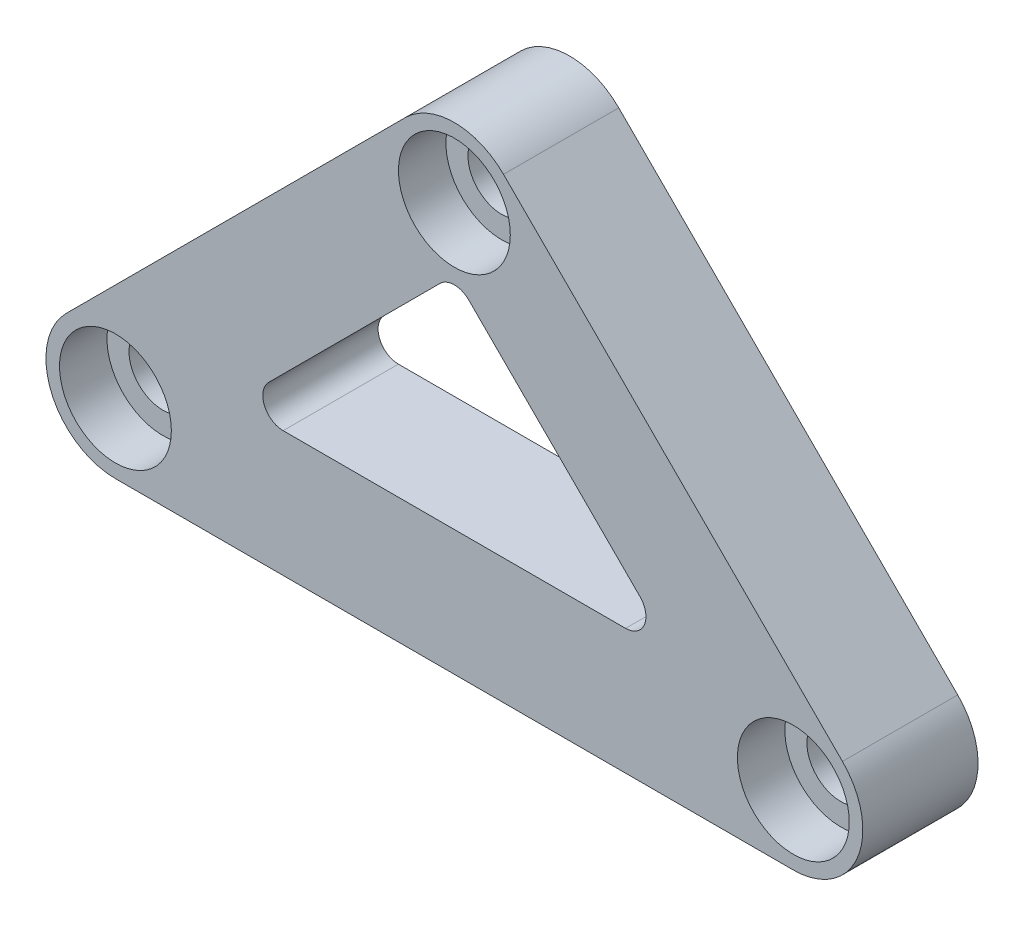
ISO-10303-21;
HEADER;
FILE_DESCRIPTION(('STEP AP214'),'2;1');
FILE_NAME('part.step','',(''),(''),'','','');
FILE_SCHEMA(('AUTOMOTIVE_DESIGN { 1 0 10303 214 1 1 1 1 }'));
ENDSEC;
DATA;
#1=APPLICATION_CONTEXT('core data for automotive mechanical design processes');
#2=APPLICATION_PROTOCOL_DEFINITION('international standard','automotive_design',2000,#1);
#3=PRODUCT_CONTEXT('',#1,'mechanical');
#4=PRODUCT('Part','Part','',(#3));
#5=PRODUCT_RELATED_PRODUCT_CATEGORY('part','',(#4));
#6=PRODUCT_DEFINITION_FORMATION('','',#4);
#7=PRODUCT_DEFINITION_CONTEXT('part definition',#1,'design');
#8=PRODUCT_DEFINITION('design','',#6,#7);
#9=PRODUCT_DEFINITION_SHAPE('','',#8);
#10=(LENGTH_UNIT() NAMED_UNIT(*) SI_UNIT(.MILLI.,.METRE.));
#11=(NAMED_UNIT(*) PLANE_ANGLE_UNIT() SI_UNIT($,.RADIAN.));
#12=(NAMED_UNIT(*) SI_UNIT($,.STERADIAN.) SOLID_ANGLE_UNIT());
#13=UNCERTAINTY_MEASURE_WITH_UNIT(LENGTH_MEASURE(1.E-05),#10,'distance_accuracy_value','');
#14=(GEOMETRIC_REPRESENTATION_CONTEXT(3) GLOBAL_UNCERTAINTY_ASSIGNED_CONTEXT((#13)) GLOBAL_UNIT_ASSIGNED_CONTEXT((#10,
#11,#12)) REPRESENTATION_CONTEXT('',''));
#15=CARTESIAN_POINT('',(0.,0.,0.));
#16=DIRECTION('',(0.,0.,1.));
#17=DIRECTION('',(1.,0.,0.));
#18=AXIS2_PLACEMENT_3D('',#15,#16,#17);
#19=CARTESIAN_POINT('',(7.24784450716208,7.24784450716215,17.));
#20=DIRECTION('',(-0.707106781186544,-0.707106781186551,0.));
#21=DIRECTION('',(0.707106781186551,-0.707106781186544,0.));
#22=AXIS2_PLACEMENT_3D('',#19,#20,#21);
#23=PLANE('',#22);
#24=DIRECTION('',(-0.707106781186551,0.707106781186544,0.));
#25=VECTOR('',#24,1.);
#26=CARTESIAN_POINT('',(7.24784450716208,7.24784450716215,0.));
#27=LINE('',#26,#25);
#28=CARTESIAN_POINT('',(7.24784450716208,7.24784450716215,0.));
#29=VERTEX_POINT('',#28);
#30=CARTESIAN_POINT('',(-42.7521554928383,57.247844507162,0.));
#31=VERTEX_POINT('',#30);
#32=EDGE_CURVE('E157',#29,#31,#27,.T.);
#33=ORIENTED_EDGE('',*,*,#32,.T.);
#34=DIRECTION('',(0.,0.,-1.));
#35=VECTOR('',#34,1.);
#36=CARTESIAN_POINT('',(-42.7521554928383,57.247844507162,17.));
#37=LINE('',#36,#35);
#38=CARTESIAN_POINT('',(-42.7521554928383,57.247844507162,17.));
#39=VERTEX_POINT('',#38);
#40=EDGE_CURVE('E136',#39,#31,#37,.T.);
#41=ORIENTED_EDGE('',*,*,#40,.F.);
#42=DIRECTION('',(-0.707106781186551,0.707106781186544,0.));
#43=VECTOR('',#42,1.);
#44=CARTESIAN_POINT('',(7.24784450716208,7.24784450716215,17.));
#45=LINE('',#44,#43);
#46=CARTESIAN_POINT('',(7.24784450716208,7.24784450716215,17.));
#47=VERTEX_POINT('',#46);
#48=EDGE_CURVE('E144',#47,#39,#45,.T.);
#49=ORIENTED_EDGE('',*,*,#48,.F.);
#50=DIRECTION('',(0.,0.,-1.));
#51=VECTOR('',#50,1.);
#52=CARTESIAN_POINT('',(7.24784450716208,7.24784450716215,17.));
#53=LINE('',#52,#51);
#54=EDGE_CURVE('E304',#47,#29,#53,.T.);
#55=ORIENTED_EDGE('',*,*,#54,.T.);
#56=EDGE_LOOP('',(#33,#41,#49,#55));
#57=FACE_BOUND('',#56,.T.);
#58=ADVANCED_FACE('F41',(#57),#23,.F.);
#59=CARTESIAN_POINT('',(-50.0000000000004,49.9999999999998,17.));
#60=DIRECTION('',(0.,0.,-1.));
#61=DIRECTION('',(-1.,0.,0.));
#62=AXIS2_PLACEMENT_3D('',#59,#60,#61);
#63=CYLINDRICAL_SURFACE('',#62,10.25);
#64=CARTESIAN_POINT('',(-50.0000000000004,49.9999999999998,0.));
#65=DIRECTION('',(0.,0.,1.));
#66=DIRECTION('',(1.,0.,0.));
#67=AXIS2_PLACEMENT_3D('',#64,#65,#66);
#68=CIRCLE('',#67,10.25);
#69=CARTESIAN_POINT('',(-57.2478445071625,57.2478445071619,0.));
#70=VERTEX_POINT('',#69);
#71=EDGE_CURVE('E307',#31,#70,#68,.T.);
#72=ORIENTED_EDGE('',*,*,#71,.T.);
#73=DIRECTION('',(0.,0.,-1.));
#74=VECTOR('',#73,1.);
#75=CARTESIAN_POINT('',(-57.2478445071625,57.2478445071619,17.));
#76=LINE('',#75,#74);
#77=CARTESIAN_POINT('',(-57.2478445071625,57.2478445071619,17.));
#78=VERTEX_POINT('',#77);
#79=EDGE_CURVE('E138',#78,#70,#76,.T.);
#80=ORIENTED_EDGE('',*,*,#79,.F.);
#81=CARTESIAN_POINT('',(-50.0000000000004,49.9999999999998,17.));
#82=DIRECTION('',(0.,0.,1.));
#83=DIRECTION('',(1.,0.,0.));
#84=AXIS2_PLACEMENT_3D('',#81,#82,#83);
#85=CIRCLE('',#84,10.25);
#86=EDGE_CURVE('E131',#39,#78,#85,.T.);
#87=ORIENTED_EDGE('',*,*,#86,.F.);
#88=ORIENTED_EDGE('',*,*,#40,.T.);
#89=EDGE_LOOP('',(#72,#80,#87,#88));
#90=FACE_BOUND('',#89,.T.);
#91=ADVANCED_FACE('F134',(#90),#63,.T.);
#92=CARTESIAN_POINT('',(-57.2478445071623,57.2478445071621,17.));
#93=DIRECTION('',(-0.707106781186549,0.707106781186546,0.));
#94=DIRECTION('',(-0.707106781186546,-0.707106781186549,0.));
#95=AXIS2_PLACEMENT_3D('',#92,#93,#94);
#96=PLANE('',#95);
#97=DIRECTION('',(0.707106781186546,0.707106781186549,0.));
#98=VECTOR('',#97,1.);
#99=CARTESIAN_POINT('',(-57.2478445071623,57.2478445071621,0.));
#100=LINE('',#99,#98);
#101=CARTESIAN_POINT('',(-107.247844507162,7.2478445071621,0.));
#102=VERTEX_POINT('',#101);
#103=EDGE_CURVE('E310',#102,#70,#100,.T.);
#104=ORIENTED_EDGE('',*,*,#103,.F.);
#105=DIRECTION('',(0.,0.,-1.));
#106=VECTOR('',#105,1.);
#107=CARTESIAN_POINT('',(-107.247844507162,7.2478445071621,17.));
#108=LINE('',#107,#106);
#109=CARTESIAN_POINT('',(-107.247844507162,7.2478445071621,17.));
#110=VERTEX_POINT('',#109);
#111=EDGE_CURVE('E165',#110,#102,#108,.T.);
#112=ORIENTED_EDGE('',*,*,#111,.F.);
#113=DIRECTION('',(0.707106781186546,0.707106781186549,0.));
#114=VECTOR('',#113,1.);
#115=CARTESIAN_POINT('',(-57.2478445071623,57.2478445071621,17.));
#116=LINE('',#115,#114);
#117=EDGE_CURVE('E143',#110,#78,#116,.T.);
#118=ORIENTED_EDGE('',*,*,#117,.T.);
#119=ORIENTED_EDGE('',*,*,#79,.T.);
#120=EDGE_LOOP('',(#104,#112,#118,#119));
#121=FACE_BOUND('',#120,.T.);
#122=ADVANCED_FACE('F342',(#121),#96,.T.);
#123=CARTESIAN_POINT('',(-100.,0.,17.));
#124=DIRECTION('',(0.,0.,-1.));
#125=DIRECTION('',(-1.,0.,0.));
#126=AXIS2_PLACEMENT_3D('',#123,#124,#125);
#127=CYLINDRICAL_SURFACE('',#126,10.25);
#128=CARTESIAN_POINT('',(-100.,0.,0.));
#129=DIRECTION('',(0.,0.,1.));
#130=DIRECTION('',(1.,0.,0.));
#131=AXIS2_PLACEMENT_3D('',#128,#129,#130);
#132=CIRCLE('',#131,10.25);
#133=CARTESIAN_POINT('',(-100.,-10.25,0.));
#134=VERTEX_POINT('',#133);
#135=EDGE_CURVE('E314',#102,#134,#132,.T.);
#136=ORIENTED_EDGE('',*,*,#135,.T.);
#137=DIRECTION('',(0.,0.,-1.));
#138=VECTOR('',#137,1.);
#139=CARTESIAN_POINT('',(-100.,-10.25,17.));
#140=LINE('',#139,#138);
#141=CARTESIAN_POINT('',(-100.,-10.25,17.));
#142=VERTEX_POINT('',#141);
#143=EDGE_CURVE('E328',#142,#134,#140,.T.);
#144=ORIENTED_EDGE('',*,*,#143,.F.);
#145=CARTESIAN_POINT('',(-100.,0.,17.));
#146=DIRECTION('',(0.,0.,1.));
#147=DIRECTION('',(1.,0.,0.));
#148=AXIS2_PLACEMENT_3D('',#145,#146,#147);
#149=CIRCLE('',#148,10.25);
#150=EDGE_CURVE('E296',#110,#142,#149,.T.);
#151=ORIENTED_EDGE('',*,*,#150,.F.);
#152=ORIENTED_EDGE('',*,*,#111,.T.);
#153=EDGE_LOOP('',(#136,#144,#151,#152));
#154=FACE_BOUND('',#153,.T.);
#155=ADVANCED_FACE('F335',(#154),#127,.T.);
#156=CARTESIAN_POINT('',(0.,-10.25,17.));
#157=DIRECTION('',(0.,1.,0.));
#158=DIRECTION('',(0.,0.,1.));
#159=AXIS2_PLACEMENT_3D('',#156,#157,#158);
#160=PLANE('',#159);
#161=DIRECTION('',(1.,0.,0.));
#162=VECTOR('',#161,1.);
#163=CARTESIAN_POINT('',(0.,-10.25,0.));
#164=LINE('',#163,#162);
#165=CARTESIAN_POINT('',(0.,-10.25,0.));
#166=VERTEX_POINT('',#165);
#167=EDGE_CURVE('E317',#134,#166,#164,.T.);
#168=ORIENTED_EDGE('',*,*,#167,.T.);
#169=DIRECTION('',(0.,0.,-1.));
#170=VECTOR('',#169,1.);
#171=CARTESIAN_POINT('',(0.,-10.25,17.));
#172=LINE('',#171,#170);
#173=CARTESIAN_POINT('',(0.,-10.25,17.));
#174=VERTEX_POINT('',#173);
#175=EDGE_CURVE('E324',#174,#166,#172,.T.);
#176=ORIENTED_EDGE('',*,*,#175,.F.);
#177=DIRECTION('',(1.,0.,0.));
#178=VECTOR('',#177,1.);
#179=CARTESIAN_POINT('',(0.,-10.25,17.));
#180=LINE('',#179,#178);
#181=EDGE_CURVE('E299',#142,#174,#180,.T.);
#182=ORIENTED_EDGE('',*,*,#181,.F.);
#183=ORIENTED_EDGE('',*,*,#143,.T.);
#184=EDGE_LOOP('',(#168,#176,#182,#183));
#185=FACE_BOUND('',#184,.T.);
#186=ADVANCED_FACE('F348',(#185),#160,.F.);
#187=CARTESIAN_POINT('',(0.,0.,17.));
#188=DIRECTION('',(0.,0.,-1.));
#189=DIRECTION('',(-1.,0.,0.));
#190=AXIS2_PLACEMENT_3D('',#187,#188,#189);
#191=CYLINDRICAL_SURFACE('',#190,10.25);
#192=CARTESIAN_POINT('',(0.,0.,0.));
#193=DIRECTION('',(0.,0.,1.));
#194=DIRECTION('',(1.,0.,0.));
#195=AXIS2_PLACEMENT_3D('',#192,#193,#194);
#196=CIRCLE('',#195,10.25);
#197=EDGE_CURVE('E154',#166,#29,#196,.T.);
#198=ORIENTED_EDGE('',*,*,#197,.T.);
#199=ORIENTED_EDGE('',*,*,#54,.F.);
#200=CARTESIAN_POINT('',(0.,0.,17.));
#201=DIRECTION('',(0.,0.,1.));
#202=DIRECTION('',(1.,0.,0.));
#203=AXIS2_PLACEMENT_3D('',#200,#201,#202);
#204=CIRCLE('',#203,10.25);
#205=EDGE_CURVE('E149',#174,#47,#204,.T.);
#206=ORIENTED_EDGE('',*,*,#205,.F.);
#207=ORIENTED_EDGE('',*,*,#175,.T.);
#208=EDGE_LOOP('',(#198,#199,#206,#207));
#209=FACE_BOUND('',#208,.T.);
#210=ADVANCED_FACE('F344',(#209),#191,.T.);
#211=CARTESIAN_POINT('',(0.,0.,17.));
#212=DIRECTION('',(0.,0.,1.));
#213=DIRECTION('',(1.,0.,0.));
#214=AXIS2_PLACEMENT_3D('',#211,#212,#213);
#215=PLANE('',#214);
#216=DIRECTION('',(0.707106781186551,-0.707106781186544,0.));
#217=VECTOR('',#216,1.);
#218=CARTESIAN_POINT('',(-17.5000000000002,8.25,17.));
#219=LINE('',#218,#217);
#220=CARTESIAN_POINT('',(-47.8786796564407,38.6286796564402,17.));
#221=VERTEX_POINT('',#220);
#222=CARTESIAN_POINT('',(-22.6213203435599,13.3713203435597,17.));
#223=VERTEX_POINT('',#222);
#224=EDGE_CURVE('E231',#221,#223,#219,.T.);
#225=ORIENTED_EDGE('',*,*,#224,.T.);
#226=CARTESIAN_POINT('',(-24.7426406871196,11.25,17.));
#227=DIRECTION('',(0.,0.,1.));
#228=DIRECTION('',(1.,0.,0.));
#229=AXIS2_PLACEMENT_3D('',#226,#227,#228);
#230=CIRCLE('',#229,3.);
#231=CARTESIAN_POINT('',(-24.7426406871196,8.25,17.));
#232=VERTEX_POINT('',#231);
#233=EDGE_CURVE('E209',#223,#232,#230,.F.);
#234=ORIENTED_EDGE('',*,*,#233,.T.);
#235=DIRECTION('',(-1.,0.,0.));
#236=VECTOR('',#235,1.);
#237=CARTESIAN_POINT('',(-82.5000000000005,8.25000000000001,17.));
#238=LINE('',#237,#236);
#239=CARTESIAN_POINT('',(-75.2573593128812,8.25000000000001,17.));
#240=VERTEX_POINT('',#239);
#241=EDGE_CURVE('E242',#232,#240,#238,.T.);
#242=ORIENTED_EDGE('',*,*,#241,.T.);
#243=CARTESIAN_POINT('',(-75.2573593128812,11.25,17.));
#244=DIRECTION('',(0.,0.,1.));
#245=DIRECTION('',(1.,0.,0.));
#246=AXIS2_PLACEMENT_3D('',#243,#244,#245);
#247=CIRCLE('',#246,3.);
#248=CARTESIAN_POINT('',(-77.3786796564408,13.3713203435597,17.));
#249=VERTEX_POINT('',#248);
#250=EDGE_CURVE('E203',#240,#249,#247,.F.);
#251=ORIENTED_EDGE('',*,*,#250,.T.);
#252=DIRECTION('',(0.707106781186551,0.707106781186543,0.));
#253=VECTOR('',#252,1.);
#254=CARTESIAN_POINT('',(-50.0000000000004,40.7499999999998,17.));
#255=LINE('',#254,#253);
#256=CARTESIAN_POINT('',(-52.12132034356,38.6286796564402,17.));
#257=VERTEX_POINT('',#256);
#258=EDGE_CURVE('E235',#249,#257,#255,.T.);
#259=ORIENTED_EDGE('',*,*,#258,.T.);
#260=CARTESIAN_POINT('',(-50.0000000000004,36.5073593128806,17.));
#261=DIRECTION('',(0.,0.,1.));
#262=DIRECTION('',(1.,0.,0.));
#263=AXIS2_PLACEMENT_3D('',#260,#261,#262);
#264=CIRCLE('',#263,3.);
#265=EDGE_CURVE('E11',#257,#221,#264,.F.);
#266=ORIENTED_EDGE('',*,*,#265,.T.);
#267=EDGE_LOOP('',(#225,#234,#242,#251,#259,#266));
#268=FACE_BOUND('',#267,.T.);
#269=CARTESIAN_POINT('',(-100.,0.,17.));
#270=DIRECTION('',(0.,0.,1.));
#271=DIRECTION('',(1.,0.,0.));
#272=AXIS2_PLACEMENT_3D('',#269,#270,#271);
#273=CIRCLE('',#272,8.25000000000001);
#274=CARTESIAN_POINT('',(-91.75,0.,17.));
#275=VERTEX_POINT('',#274);
#276=EDGE_CURVE('E256',#275,#275,#273,.T.);
#277=ORIENTED_EDGE('',*,*,#276,.F.);
#278=EDGE_LOOP('',(#277));
#279=FACE_BOUND('',#278,.T.);
#280=CARTESIAN_POINT('',(-50.0000000000004,49.9999999999998,17.));
#281=DIRECTION('',(0.,0.,1.));
#282=DIRECTION('',(1.,0.,0.));
#283=AXIS2_PLACEMENT_3D('',#280,#281,#282);
#284=CIRCLE('',#283,8.25);
#285=CARTESIAN_POINT('',(-41.7500000000004,49.9999999999998,17.));
#286=VERTEX_POINT('',#285);
#287=EDGE_CURVE('E264',#286,#286,#284,.T.);
#288=ORIENTED_EDGE('',*,*,#287,.F.);
#289=EDGE_LOOP('',(#288));
#290=FACE_BOUND('',#289,.T.);
#291=CARTESIAN_POINT('',(0.,0.,17.));
#292=DIRECTION('',(0.,0.,1.));
#293=DIRECTION('',(1.,0.,0.));
#294=AXIS2_PLACEMENT_3D('',#291,#292,#293);
#295=CIRCLE('',#294,8.25);
#296=CARTESIAN_POINT('',(8.25,0.,17.));
#297=VERTEX_POINT('',#296);
#298=EDGE_CURVE('E234',#297,#297,#295,.T.);
#299=ORIENTED_EDGE('',*,*,#298,.F.);
#300=EDGE_LOOP('',(#299));
#301=FACE_BOUND('',#300,.T.);
#302=ORIENTED_EDGE('',*,*,#48,.T.);
#303=ORIENTED_EDGE('',*,*,#86,.T.);
#304=ORIENTED_EDGE('',*,*,#117,.F.);
#305=ORIENTED_EDGE('',*,*,#150,.T.);
#306=ORIENTED_EDGE('',*,*,#181,.T.);
#307=ORIENTED_EDGE('',*,*,#205,.T.);
#308=EDGE_LOOP('',(#302,#303,#304,#305,#306,#307));
#309=FACE_BOUND('',#308,.T.);
#310=ADVANCED_FACE('F147',(#268,#279,#290,#301,#309),#215,.T.);
#311=CARTESIAN_POINT('',(0.,0.,0.));
#312=DIRECTION('',(0.,0.,1.));
#313=DIRECTION('',(1.,0.,0.));
#314=AXIS2_PLACEMENT_3D('',#311,#312,#313);
#315=PLANE('',#314);
#316=DIRECTION('',(0.707106781186551,0.707106781186543,0.));
#317=VECTOR('',#316,1.);
#318=CARTESIAN_POINT('',(-50.0000000000004,40.7499999999998,0.));
#319=LINE('',#318,#317);
#320=CARTESIAN_POINT('',(-77.3786796564408,13.3713203435597,0.));
#321=VERTEX_POINT('',#320);
#322=CARTESIAN_POINT('',(-52.12132034356,38.6286796564402,0.));
#323=VERTEX_POINT('',#322);
#324=EDGE_CURVE('E218',#321,#323,#319,.T.);
#325=ORIENTED_EDGE('',*,*,#324,.F.);
#326=CARTESIAN_POINT('',(-75.2573593128812,11.25,0.));
#327=DIRECTION('',(0.,0.,1.));
#328=DIRECTION('',(1.,0.,0.));
#329=AXIS2_PLACEMENT_3D('',#326,#327,#328);
#330=CIRCLE('',#329,3.);
#331=CARTESIAN_POINT('',(-75.2573593128812,8.25000000000001,0.));
#332=VERTEX_POINT('',#331);
#333=EDGE_CURVE('E200',#321,#332,#330,.T.);
#334=ORIENTED_EDGE('',*,*,#333,.T.);
#335=DIRECTION('',(-1.,0.,0.));
#336=VECTOR('',#335,1.);
#337=CARTESIAN_POINT('',(-82.5000000000005,8.25000000000001,0.));
#338=LINE('',#337,#336);
#339=CARTESIAN_POINT('',(-24.7426406871196,8.25,0.));
#340=VERTEX_POINT('',#339);
#341=EDGE_CURVE('E228',#340,#332,#338,.T.);
#342=ORIENTED_EDGE('',*,*,#341,.F.);
#343=CARTESIAN_POINT('',(-24.7426406871196,11.25,0.));
#344=DIRECTION('',(0.,0.,1.));
#345=DIRECTION('',(1.,0.,0.));
#346=AXIS2_PLACEMENT_3D('',#343,#344,#345);
#347=CIRCLE('',#346,3.);
#348=CARTESIAN_POINT('',(-22.6213203435599,13.3713203435597,0.));
#349=VERTEX_POINT('',#348);
#350=EDGE_CURVE('E206',#340,#349,#347,.T.);
#351=ORIENTED_EDGE('',*,*,#350,.T.);
#352=DIRECTION('',(0.707106781186551,-0.707106781186544,0.));
#353=VECTOR('',#352,1.);
#354=CARTESIAN_POINT('',(-17.5000000000002,8.25,0.));
#355=LINE('',#354,#353);
#356=CARTESIAN_POINT('',(-47.8786796564407,38.6286796564402,0.));
#357=VERTEX_POINT('',#356);
#358=EDGE_CURVE('E219',#357,#349,#355,.T.);
#359=ORIENTED_EDGE('',*,*,#358,.F.);
#360=CARTESIAN_POINT('',(-50.0000000000004,36.5073593128806,0.));
#361=DIRECTION('',(0.,0.,1.));
#362=DIRECTION('',(1.,0.,0.));
#363=AXIS2_PLACEMENT_3D('',#360,#361,#362);
#364=CIRCLE('',#363,3.);
#365=EDGE_CURVE('E50',#357,#323,#364,.T.);
#366=ORIENTED_EDGE('',*,*,#365,.T.);
#367=EDGE_LOOP('',(#325,#334,#342,#351,#359,#366));
#368=FACE_BOUND('',#367,.T.);
#369=CARTESIAN_POINT('',(0.,0.,0.));
#370=DIRECTION('',(0.,0.,-1.));
#371=DIRECTION('',(-1.,0.,0.));
#372=AXIS2_PLACEMENT_3D('',#369,#370,#371);
#373=CIRCLE('',#372,8.25);
#374=CARTESIAN_POINT('',(-8.25,0.,0.));
#375=VERTEX_POINT('',#374);
#376=EDGE_CURVE('E275',#375,#375,#373,.T.);
#377=ORIENTED_EDGE('',*,*,#376,.F.);
#378=EDGE_LOOP('',(#377));
#379=FACE_BOUND('',#378,.T.);
#380=CARTESIAN_POINT('',(-50.0000000000004,49.9999999999998,0.));
#381=DIRECTION('',(0.,0.,-1.));
#382=DIRECTION('',(-1.,0.,0.));
#383=AXIS2_PLACEMENT_3D('',#380,#381,#382);
#384=CIRCLE('',#383,8.25);
#385=CARTESIAN_POINT('',(-58.2500000000004,49.9999999999998,0.));
#386=VERTEX_POINT('',#385);
#387=EDGE_CURVE('E283',#386,#386,#384,.T.);
#388=ORIENTED_EDGE('',*,*,#387,.F.);
#389=EDGE_LOOP('',(#388));
#390=FACE_BOUND('',#389,.T.);
#391=CARTESIAN_POINT('',(-100.,0.,0.));
#392=DIRECTION('',(0.,0.,-1.));
#393=DIRECTION('',(-1.,0.,0.));
#394=AXIS2_PLACEMENT_3D('',#391,#392,#393);
#395=CIRCLE('',#394,8.25000000000001);
#396=CARTESIAN_POINT('',(-108.25,0.,0.));
#397=VERTEX_POINT('',#396);
#398=EDGE_CURVE('E255',#397,#397,#395,.T.);
#399=ORIENTED_EDGE('',*,*,#398,.F.);
#400=EDGE_LOOP('',(#399));
#401=FACE_BOUND('',#400,.T.);
#402=ORIENTED_EDGE('',*,*,#32,.F.);
#403=ORIENTED_EDGE('',*,*,#197,.F.);
#404=ORIENTED_EDGE('',*,*,#167,.F.);
#405=ORIENTED_EDGE('',*,*,#135,.F.);
#406=ORIENTED_EDGE('',*,*,#103,.T.);
#407=ORIENTED_EDGE('',*,*,#71,.F.);
#408=EDGE_LOOP('',(#402,#403,#404,#405,#406,#407));
#409=FACE_BOUND('',#408,.T.);
#410=ADVANCED_FACE('F216',(#368,#379,#390,#401,#409),#315,.F.);
#411=CARTESIAN_POINT('',(-100.,0.,7.));
#412=DIRECTION('',(0.,0.,-1.));
#413=DIRECTION('',(-1.,0.,0.));
#414=AXIS2_PLACEMENT_3D('',#411,#412,#413);
#415=CYLINDRICAL_SURFACE('',#414,8.25000000000001);
#416=CARTESIAN_POINT('',(-100.,0.,7.));
#417=DIRECTION('',(0.,0.,-1.));
#418=DIRECTION('',(-1.,0.,0.));
#419=AXIS2_PLACEMENT_3D('',#416,#417,#418);
#420=CIRCLE('',#419,8.25000000000001);
#421=CARTESIAN_POINT('',(-108.25,0.,7.));
#422=VERTEX_POINT('',#421);
#423=EDGE_CURVE('E287',#422,#422,#420,.T.);
#424=ORIENTED_EDGE('',*,*,#423,.F.);
#425=EDGE_LOOP('',(#424));
#426=FACE_BOUND('',#425,.T.);
#427=ORIENTED_EDGE('',*,*,#398,.T.);
#428=EDGE_LOOP('',(#427));
#429=FACE_BOUND('',#428,.T.);
#430=ADVANCED_FACE('F403',(#426,#429),#415,.F.);
#431=CARTESIAN_POINT('',(0.,0.,7.));
#432=DIRECTION('',(0.,0.,-1.));
#433=DIRECTION('',(-1.,0.,0.));
#434=AXIS2_PLACEMENT_3D('',#431,#432,#433);
#435=PLANE('',#434);
#436=CARTESIAN_POINT('',(-100.,0.,7.));
#437=DIRECTION('',(0.,0.,-1.));
#438=DIRECTION('',(-1.,0.,0.));
#439=AXIS2_PLACEMENT_3D('',#436,#437,#438);
#440=CIRCLE('',#439,5.);
#441=CARTESIAN_POINT('',(-95.,0.,7.));
#442=VERTEX_POINT('',#441);
#443=EDGE_CURVE('E173',#442,#442,#440,.T.);
#444=ORIENTED_EDGE('',*,*,#443,.F.);
#445=EDGE_LOOP('',(#444));
#446=FACE_BOUND('',#445,.T.);
#447=ORIENTED_EDGE('',*,*,#423,.T.);
#448=EDGE_LOOP('',(#447));
#449=FACE_BOUND('',#448,.T.);
#450=ADVANCED_FACE('F399',(#446,#449),#435,.T.);
#451=CARTESIAN_POINT('',(-50.0000000000004,49.9999999999998,7.));
#452=DIRECTION('',(0.,0.,-1.));
#453=DIRECTION('',(-1.,0.,0.));
#454=AXIS2_PLACEMENT_3D('',#451,#452,#453);
#455=CYLINDRICAL_SURFACE('',#454,8.25);
#456=CARTESIAN_POINT('',(-50.0000000000004,49.9999999999998,7.));
#457=DIRECTION('',(0.,0.,-1.));
#458=DIRECTION('',(-1.,0.,0.));
#459=AXIS2_PLACEMENT_3D('',#456,#457,#458);
#460=CIRCLE('',#459,8.25);
#461=CARTESIAN_POINT('',(-58.2500000000004,49.9999999999998,7.));
#462=VERTEX_POINT('',#461);
#463=EDGE_CURVE('E279',#462,#462,#460,.T.);
#464=ORIENTED_EDGE('',*,*,#463,.F.);
#465=EDGE_LOOP('',(#464));
#466=FACE_BOUND('',#465,.T.);
#467=ORIENTED_EDGE('',*,*,#387,.T.);
#468=EDGE_LOOP('',(#467));
#469=FACE_BOUND('',#468,.T.);
#470=ADVANCED_FACE('F402',(#466,#469),#455,.F.);
#471=CARTESIAN_POINT('',(0.,0.,7.));
#472=DIRECTION('',(0.,0.,-1.));
#473=DIRECTION('',(-1.,0.,0.));
#474=AXIS2_PLACEMENT_3D('',#471,#472,#473);
#475=PLANE('',#474);
#476=CARTESIAN_POINT('',(-50.0000000000004,49.9999999999998,7.));
#477=DIRECTION('',(0.,0.,-1.));
#478=DIRECTION('',(-1.,0.,0.));
#479=AXIS2_PLACEMENT_3D('',#476,#477,#478);
#480=CIRCLE('',#479,5.);
#481=CARTESIAN_POINT('',(-45.0000000000004,49.9999999999998,7.));
#482=VERTEX_POINT('',#481);
#483=EDGE_CURVE('E178',#482,#482,#480,.T.);
#484=ORIENTED_EDGE('',*,*,#483,.F.);
#485=EDGE_LOOP('',(#484));
#486=FACE_BOUND('',#485,.T.);
#487=ORIENTED_EDGE('',*,*,#463,.T.);
#488=EDGE_LOOP('',(#487));
#489=FACE_BOUND('',#488,.T.);
#490=ADVANCED_FACE('F421',(#486,#489),#475,.T.);
#491=CARTESIAN_POINT('',(0.,0.,7.));
#492=DIRECTION('',(0.,0.,-1.));
#493=DIRECTION('',(-1.,0.,0.));
#494=AXIS2_PLACEMENT_3D('',#491,#492,#493);
#495=CYLINDRICAL_SURFACE('',#494,8.25);
#496=CARTESIAN_POINT('',(0.,0.,7.));
#497=DIRECTION('',(0.,0.,-1.));
#498=DIRECTION('',(-1.,0.,0.));
#499=AXIS2_PLACEMENT_3D('',#496,#497,#498);
#500=CIRCLE('',#499,8.25);
#501=CARTESIAN_POINT('',(-8.25,0.,7.));
#502=VERTEX_POINT('',#501);
#503=EDGE_CURVE('E271',#502,#502,#500,.T.);
#504=ORIENTED_EDGE('',*,*,#503,.F.);
#505=EDGE_LOOP('',(#504));
#506=FACE_BOUND('',#505,.T.);
#507=ORIENTED_EDGE('',*,*,#376,.T.);
#508=EDGE_LOOP('',(#507));
#509=FACE_BOUND('',#508,.T.);
#510=ADVANCED_FACE('F425',(#506,#509),#495,.F.);
#511=CARTESIAN_POINT('',(0.,0.,7.));
#512=DIRECTION('',(0.,0.,-1.));
#513=DIRECTION('',(-1.,0.,0.));
#514=AXIS2_PLACEMENT_3D('',#511,#512,#513);
#515=PLANE('',#514);
#516=CARTESIAN_POINT('',(0.,0.,7.));
#517=DIRECTION('',(0.,0.,-1.));
#518=DIRECTION('',(-1.,0.,0.));
#519=AXIS2_PLACEMENT_3D('',#516,#517,#518);
#520=CIRCLE('',#519,5.);
#521=CARTESIAN_POINT('',(5.,0.,7.));
#522=VERTEX_POINT('',#521);
#523=EDGE_CURVE('E182',#522,#522,#520,.T.);
#524=ORIENTED_EDGE('',*,*,#523,.F.);
#525=EDGE_LOOP('',(#524));
#526=FACE_BOUND('',#525,.T.);
#527=ORIENTED_EDGE('',*,*,#503,.T.);
#528=EDGE_LOOP('',(#527));
#529=FACE_BOUND('',#528,.T.);
#530=ADVANCED_FACE('F429',(#526,#529),#515,.T.);
#531=CARTESIAN_POINT('',(0.,0.,10.));
#532=DIRECTION('',(0.,0.,1.));
#533=DIRECTION('',(1.,0.,0.));
#534=AXIS2_PLACEMENT_3D('',#531,#532,#533);
#535=CYLINDRICAL_SURFACE('',#534,8.25);
#536=CARTESIAN_POINT('',(0.,0.,10.));
#537=DIRECTION('',(0.,0.,1.));
#538=DIRECTION('',(1.,0.,0.));
#539=AXIS2_PLACEMENT_3D('',#536,#537,#538);
#540=CIRCLE('',#539,8.25);
#541=CARTESIAN_POINT('',(8.25,0.,10.));
#542=VERTEX_POINT('',#541);
#543=EDGE_CURVE('E240',#542,#542,#540,.T.);
#544=ORIENTED_EDGE('',*,*,#543,.F.);
#545=EDGE_LOOP('',(#544));
#546=FACE_BOUND('',#545,.T.);
#547=ORIENTED_EDGE('',*,*,#298,.T.);
#548=EDGE_LOOP('',(#547));
#549=FACE_BOUND('',#548,.T.);
#550=ADVANCED_FACE('F433',(#546,#549),#535,.F.);
#551=CARTESIAN_POINT('',(0.,0.,10.));
#552=DIRECTION('',(0.,0.,1.));
#553=DIRECTION('',(1.,0.,0.));
#554=AXIS2_PLACEMENT_3D('',#551,#552,#553);
#555=PLANE('',#554);
#556=CARTESIAN_POINT('',(0.,0.,10.));
#557=DIRECTION('',(0.,0.,1.));
#558=DIRECTION('',(1.,0.,0.));
#559=AXIS2_PLACEMENT_3D('',#556,#557,#558);
#560=CIRCLE('',#559,5.);
#561=CARTESIAN_POINT('',(5.,0.,10.));
#562=VERTEX_POINT('',#561);
#563=EDGE_CURVE('E179',#562,#562,#560,.T.);
#564=ORIENTED_EDGE('',*,*,#563,.F.);
#565=EDGE_LOOP('',(#564));
#566=FACE_BOUND('',#565,.T.);
#567=ORIENTED_EDGE('',*,*,#543,.T.);
#568=EDGE_LOOP('',(#567));
#569=FACE_BOUND('',#568,.T.);
#570=ADVANCED_FACE('F437',(#566,#569),#555,.T.);
#571=CARTESIAN_POINT('',(-50.0000000000004,49.9999999999998,10.));
#572=DIRECTION('',(0.,0.,1.));
#573=DIRECTION('',(1.,0.,0.));
#574=AXIS2_PLACEMENT_3D('',#571,#572,#573);
#575=CYLINDRICAL_SURFACE('',#574,8.25);
#576=CARTESIAN_POINT('',(-50.0000000000004,49.9999999999998,10.));
#577=DIRECTION('',(0.,0.,1.));
#578=DIRECTION('',(1.,0.,0.));
#579=AXIS2_PLACEMENT_3D('',#576,#577,#578);
#580=CIRCLE('',#579,8.25);
#581=CARTESIAN_POINT('',(-41.7500000000004,49.9999999999998,10.));
#582=VERTEX_POINT('',#581);
#583=EDGE_CURVE('E260',#582,#582,#580,.T.);
#584=ORIENTED_EDGE('',*,*,#583,.F.);
#585=EDGE_LOOP('',(#584));
#586=FACE_BOUND('',#585,.T.);
#587=ORIENTED_EDGE('',*,*,#287,.T.);
#588=EDGE_LOOP('',(#587));
#589=FACE_BOUND('',#588,.T.);
#590=ADVANCED_FACE('F441',(#586,#589),#575,.F.);
#591=CARTESIAN_POINT('',(-50.0000000000004,49.9999999999998,10.));
#592=DIRECTION('',(0.,0.,1.));
#593=DIRECTION('',(1.,0.,0.));
#594=AXIS2_PLACEMENT_3D('',#591,#592,#593);
#595=PLANE('',#594);
#596=CARTESIAN_POINT('',(-50.0000000000004,49.9999999999998,10.));
#597=DIRECTION('',(0.,0.,1.));
#598=DIRECTION('',(1.,0.,0.));
#599=AXIS2_PLACEMENT_3D('',#596,#597,#598);
#600=CIRCLE('',#599,5.);
#601=CARTESIAN_POINT('',(-45.0000000000004,49.9999999999998,10.));
#602=VERTEX_POINT('',#601);
#603=EDGE_CURVE('E174',#602,#602,#600,.T.);
#604=ORIENTED_EDGE('',*,*,#603,.F.);
#605=EDGE_LOOP('',(#604));
#606=FACE_BOUND('',#605,.T.);
#607=ORIENTED_EDGE('',*,*,#583,.T.);
#608=EDGE_LOOP('',(#607));
#609=FACE_BOUND('',#608,.T.);
#610=ADVANCED_FACE('F445',(#606,#609),#595,.T.);
#611=CARTESIAN_POINT('',(-100.,0.,10.));
#612=DIRECTION('',(0.,0.,1.));
#613=DIRECTION('',(1.,0.,0.));
#614=AXIS2_PLACEMENT_3D('',#611,#612,#613);
#615=CYLINDRICAL_SURFACE('',#614,8.25000000000001);
#616=CARTESIAN_POINT('',(-100.,0.,10.));
#617=DIRECTION('',(0.,0.,1.));
#618=DIRECTION('',(1.,0.,0.));
#619=AXIS2_PLACEMENT_3D('',#616,#617,#618);
#620=CIRCLE('',#619,8.25000000000001);
#621=CARTESIAN_POINT('',(-91.75,0.,10.));
#622=VERTEX_POINT('',#621);
#623=EDGE_CURVE('E251',#622,#622,#620,.T.);
#624=ORIENTED_EDGE('',*,*,#623,.F.);
#625=EDGE_LOOP('',(#624));
#626=FACE_BOUND('',#625,.T.);
#627=ORIENTED_EDGE('',*,*,#276,.T.);
#628=EDGE_LOOP('',(#627));
#629=FACE_BOUND('',#628,.T.);
#630=ADVANCED_FACE('F449',(#626,#629),#615,.F.);
#631=CARTESIAN_POINT('',(-100.,0.,10.));
#632=DIRECTION('',(0.,0.,1.));
#633=DIRECTION('',(1.,0.,0.));
#634=AXIS2_PLACEMENT_3D('',#631,#632,#633);
#635=PLANE('',#634);
#636=CARTESIAN_POINT('',(-100.,0.,10.));
#637=DIRECTION('',(0.,0.,1.));
#638=DIRECTION('',(1.,0.,0.));
#639=AXIS2_PLACEMENT_3D('',#636,#637,#638);
#640=CIRCLE('',#639,5.);
#641=CARTESIAN_POINT('',(-95.,0.,10.));
#642=VERTEX_POINT('',#641);
#643=EDGE_CURVE('E169',#642,#642,#640,.T.);
#644=ORIENTED_EDGE('',*,*,#643,.F.);
#645=EDGE_LOOP('',(#644));
#646=FACE_BOUND('',#645,.T.);
#647=ORIENTED_EDGE('',*,*,#623,.T.);
#648=EDGE_LOOP('',(#647));
#649=FACE_BOUND('',#648,.T.);
#650=ADVANCED_FACE('F453',(#646,#649),#635,.T.);
#651=CARTESIAN_POINT('',(-82.5000000000005,8.25000000000001,17.));
#652=DIRECTION('',(0.,-1.,0.));
#653=DIRECTION('',(1.,0.,0.));
#654=AXIS2_PLACEMENT_3D('',#651,#652,#653);
#655=PLANE('',#654);
#656=ORIENTED_EDGE('',*,*,#341,.T.);
#657=DIRECTION('',(0.,0.,-1.));
#658=VECTOR('',#657,1.);
#659=CARTESIAN_POINT('',(-75.2573593128812,8.25000000000001,17.));
#660=LINE('',#659,#658);
#661=EDGE_CURVE('E191',#332,#240,#660,.F.);
#662=ORIENTED_EDGE('',*,*,#661,.T.);
#663=ORIENTED_EDGE('',*,*,#241,.F.);
#664=DIRECTION('',(0.,0.,-1.));
#665=VECTOR('',#664,1.);
#666=CARTESIAN_POINT('',(-24.7426406871196,8.25,0.));
#667=LINE('',#666,#665);
#668=EDGE_CURVE('E187',#232,#340,#667,.T.);
#669=ORIENTED_EDGE('',*,*,#668,.T.);
#670=EDGE_LOOP('',(#656,#662,#663,#669));
#671=FACE_BOUND('',#670,.T.);
#672=ADVANCED_FACE('F381',(#671),#655,.F.);
#673=CARTESIAN_POINT('',(-17.5000000000002,8.25,17.));
#674=DIRECTION('',(0.707106781186544,0.707106781186551,0.));
#675=DIRECTION('',(-0.707106781186551,0.707106781186544,0.));
#676=AXIS2_PLACEMENT_3D('',#673,#674,#675);
#677=PLANE('',#676);
#678=ORIENTED_EDGE('',*,*,#358,.T.);
#679=DIRECTION('',(0.,0.,-1.));
#680=VECTOR('',#679,1.);
#681=CARTESIAN_POINT('',(-22.6213203435599,13.3713203435597,17.));
#682=LINE('',#681,#680);
#683=EDGE_CURVE('E57',#349,#223,#682,.F.);
#684=ORIENTED_EDGE('',*,*,#683,.T.);
#685=ORIENTED_EDGE('',*,*,#224,.F.);
#686=DIRECTION('',(0.,0.,-1.));
#687=VECTOR('',#686,1.);
#688=CARTESIAN_POINT('',(-47.8786796564407,38.6286796564402,0.));
#689=LINE('',#688,#687);
#690=EDGE_CURVE('E194',#221,#357,#689,.T.);
#691=ORIENTED_EDGE('',*,*,#690,.T.);
#692=EDGE_LOOP('',(#678,#684,#685,#691));
#693=FACE_BOUND('',#692,.T.);
#694=ADVANCED_FACE('F230',(#693),#677,.F.);
#695=CARTESIAN_POINT('',(-50.0000000000004,40.7499999999998,17.));
#696=DIRECTION('',(-0.707106781186544,0.707106781186552,0.));
#697=DIRECTION('',(-0.707106781186552,-0.707106781186544,0.));
#698=AXIS2_PLACEMENT_3D('',#695,#696,#697);
#699=PLANE('',#698);
#700=ORIENTED_EDGE('',*,*,#258,.F.);
#701=DIRECTION('',(0.,0.,-1.));
#702=VECTOR('',#701,1.);
#703=CARTESIAN_POINT('',(-77.3786796564408,13.3713203435597,0.));
#704=LINE('',#703,#702);
#705=EDGE_CURVE('E163',#249,#321,#704,.T.);
#706=ORIENTED_EDGE('',*,*,#705,.T.);
#707=ORIENTED_EDGE('',*,*,#324,.T.);
#708=DIRECTION('',(0.,0.,-1.));
#709=VECTOR('',#708,1.);
#710=CARTESIAN_POINT('',(-52.12132034356,38.6286796564402,17.));
#711=LINE('',#710,#709);
#712=EDGE_CURVE('E159',#323,#257,#711,.F.);
#713=ORIENTED_EDGE('',*,*,#712,.T.);
#714=EDGE_LOOP('',(#700,#706,#707,#713));
#715=FACE_BOUND('',#714,.T.);
#716=ADVANCED_FACE('F225',(#715),#699,.F.);
#717=CARTESIAN_POINT('',(-100.,0.,0.400000000000001));
#718=DIRECTION('',(0.,0.,1.));
#719=DIRECTION('',(1.,0.,0.));
#720=AXIS2_PLACEMENT_3D('',#717,#718,#719);
#721=CYLINDRICAL_SURFACE('',#720,5.);
#722=CARTESIAN_POINT('',(-95.,0.,7.));
#723=CARTESIAN_POINT('',(-95.,0.,7.03125));
#724=CARTESIAN_POINT('',(-95.,0.,7.0625));
#725=CARTESIAN_POINT('',(-95.,0.,7.125));
#726=CARTESIAN_POINT('',(-95.,0.,7.15625));
#727=CARTESIAN_POINT('',(-95.,0.,7.21875));
#728=CARTESIAN_POINT('',(-95.,0.,7.25));
#729=CARTESIAN_POINT('',(-95.,0.,7.3125));
#730=CARTESIAN_POINT('',(-95.,0.,7.34375));
#731=CARTESIAN_POINT('',(-95.,0.,7.40625));
#732=CARTESIAN_POINT('',(-95.,0.,7.4375));
#733=CARTESIAN_POINT('',(-95.,0.,7.5));
#734=CARTESIAN_POINT('',(-95.,0.,7.53125));
#735=CARTESIAN_POINT('',(-95.,0.,7.59375));
#736=CARTESIAN_POINT('',(-95.,0.,7.625));
#737=CARTESIAN_POINT('',(-95.,0.,7.6875));
#738=CARTESIAN_POINT('',(-95.,0.,7.71875));
#739=CARTESIAN_POINT('',(-95.,0.,7.78125));
#740=CARTESIAN_POINT('',(-95.,0.,7.8125));
#741=CARTESIAN_POINT('',(-95.,0.,7.875));
#742=CARTESIAN_POINT('',(-95.,0.,7.90625));
#743=CARTESIAN_POINT('',(-95.,0.,7.96875));
#744=CARTESIAN_POINT('',(-95.,0.,8.));
#745=CARTESIAN_POINT('',(-95.,0.,8.0625));
#746=CARTESIAN_POINT('',(-95.,0.,8.09375));
#747=CARTESIAN_POINT('',(-95.,0.,8.15625));
#748=CARTESIAN_POINT('',(-95.,0.,8.1875));
#749=CARTESIAN_POINT('',(-95.,0.,8.25));
#750=CARTESIAN_POINT('',(-95.,0.,8.28125));
#751=CARTESIAN_POINT('',(-95.,0.,8.34375));
#752=CARTESIAN_POINT('',(-95.,0.,8.375));
#753=CARTESIAN_POINT('',(-95.,0.,8.4375));
#754=CARTESIAN_POINT('',(-95.,0.,8.46875));
#755=CARTESIAN_POINT('',(-95.,0.,8.53125));
#756=CARTESIAN_POINT('',(-95.,0.,8.5625));
#757=CARTESIAN_POINT('',(-95.,0.,8.625));
#758=CARTESIAN_POINT('',(-95.,0.,8.65625));
#759=CARTESIAN_POINT('',(-95.,0.,8.71875));
#760=CARTESIAN_POINT('',(-95.,0.,8.75));
#761=CARTESIAN_POINT('',(-95.,0.,8.8125));
#762=CARTESIAN_POINT('',(-95.,0.,8.84375));
#763=CARTESIAN_POINT('',(-95.,0.,8.90625));
#764=CARTESIAN_POINT('',(-95.,0.,8.9375));
#765=CARTESIAN_POINT('',(-95.,0.,9.));
#766=CARTESIAN_POINT('',(-95.,0.,9.03125));
#767=CARTESIAN_POINT('',(-95.,0.,9.09375));
#768=CARTESIAN_POINT('',(-95.,0.,9.125));
#769=CARTESIAN_POINT('',(-95.,0.,9.1875));
#770=CARTESIAN_POINT('',(-95.,0.,9.21875));
#771=CARTESIAN_POINT('',(-95.,0.,9.28125));
#772=CARTESIAN_POINT('',(-95.,0.,9.3125));
#773=CARTESIAN_POINT('',(-95.,0.,9.375));
#774=CARTESIAN_POINT('',(-95.,0.,9.40625));
#775=CARTESIAN_POINT('',(-95.,0.,9.46875));
#776=CARTESIAN_POINT('',(-95.,0.,9.5));
#777=CARTESIAN_POINT('',(-95.,0.,9.5625));
#778=CARTESIAN_POINT('',(-95.,0.,9.59375));
#779=CARTESIAN_POINT('',(-95.,0.,9.65625));
#780=CARTESIAN_POINT('',(-95.,0.,9.6875));
#781=CARTESIAN_POINT('',(-95.,0.,9.75));
#782=CARTESIAN_POINT('',(-95.,0.,9.78125));
#783=CARTESIAN_POINT('',(-95.,0.,9.84375));
#784=CARTESIAN_POINT('',(-95.,0.,9.875));
#785=CARTESIAN_POINT('',(-95.,0.,9.9375));
#786=CARTESIAN_POINT('',(-95.,0.,9.96875));
#787=CARTESIAN_POINT('',(-95.,0.,10.));
#788=B_SPLINE_CURVE_WITH_KNOTS('',3,(#722,#723,#724,#725,#726,#727,#728,#729,#730,#731,#732,
#733,#734,#735,#736,#737,#738,#739,#740,#741,#742,#743,#744,#745,#746,#747,#748,#749,#750,#751,
#752,#753,#754,#755,#756,#757,#758,#759,#760,#761,#762,#763,#764,#765,#766,#767,#768,#769,#770,
#771,#772,#773,#774,#775,#776,#777,#778,#779,#780,#781,#782,#783,#784,#785,#786,#787),
.UNSPECIFIED.,.F.,.F.,(4,2,2,2,2,2,2,2,2,2,2,2,2,2,2,2,2,2,2,2,2,2,2,2,2,2,2,2,2,2,2,2,4),(0.,
0.0937500000000001,0.1875,0.28125,0.375,0.46875,0.5625,0.656250000000001,0.750000000000001,
0.84375,0.9375,1.03125,1.125,1.21875,1.3125,1.40625,1.5,1.59375,1.6875,1.78125,1.875,1.96875,
2.0625,2.15625,2.25,2.34375,2.4375,2.53125,2.625,2.71875,2.8125,2.90625,3.),.UNSPECIFIED.);
#789=EDGE_CURVE('BSEAM396',#442,#642,#788,.T.);
#790=ORIENTED_EDGE('',*,*,#443,.T.);
#791=ORIENTED_EDGE('',*,*,#643,.T.);
#792=ORIENTED_EDGE('',*,*,#789,.T.);
#793=ORIENTED_EDGE('',*,*,#789,.F.);
#794=EDGE_LOOP('',(#790,#792,#791,#793));
#795=FACE_BOUND('',#794,.T.);
#796=ADVANCED_FACE('F396',(#795),#721,.F.);
#797=CARTESIAN_POINT('',(-50.0000000000004,49.9999999999998,0.400000000000001));
#798=DIRECTION('',(0.,0.,1.));
#799=DIRECTION('',(1.,0.,0.));
#800=AXIS2_PLACEMENT_3D('',#797,#798,#799);
#801=CYLINDRICAL_SURFACE('',#800,5.);
#802=CARTESIAN_POINT('',(-45.0000000000004,49.9999999999998,7.));
#803=CARTESIAN_POINT('',(-45.0000000000004,49.9999999999998,7.03125));
#804=CARTESIAN_POINT('',(-45.0000000000004,49.9999999999998,7.0625));
#805=CARTESIAN_POINT('',(-45.0000000000004,49.9999999999998,7.125));
#806=CARTESIAN_POINT('',(-45.0000000000004,49.9999999999998,7.15625));
#807=CARTESIAN_POINT('',(-45.0000000000004,49.9999999999998,7.21875));
#808=CARTESIAN_POINT('',(-45.0000000000004,49.9999999999998,7.25));
#809=CARTESIAN_POINT('',(-45.0000000000004,49.9999999999998,7.3125));
#810=CARTESIAN_POINT('',(-45.0000000000004,49.9999999999998,7.34375));
#811=CARTESIAN_POINT('',(-45.0000000000004,49.9999999999998,7.40625));
#812=CARTESIAN_POINT('',(-45.0000000000004,49.9999999999998,7.4375));
#813=CARTESIAN_POINT('',(-45.0000000000004,49.9999999999998,7.5));
#814=CARTESIAN_POINT('',(-45.0000000000004,49.9999999999998,7.53125));
#815=CARTESIAN_POINT('',(-45.0000000000004,49.9999999999998,7.59375));
#816=CARTESIAN_POINT('',(-45.0000000000004,49.9999999999998,7.625));
#817=CARTESIAN_POINT('',(-45.0000000000004,49.9999999999998,7.6875));
#818=CARTESIAN_POINT('',(-45.0000000000004,49.9999999999998,7.71875));
#819=CARTESIAN_POINT('',(-45.0000000000004,49.9999999999998,7.78125));
#820=CARTESIAN_POINT('',(-45.0000000000004,49.9999999999998,7.8125));
#821=CARTESIAN_POINT('',(-45.0000000000004,49.9999999999998,7.875));
#822=CARTESIAN_POINT('',(-45.0000000000004,49.9999999999998,7.90625));
#823=CARTESIAN_POINT('',(-45.0000000000004,49.9999999999998,7.96875));
#824=CARTESIAN_POINT('',(-45.0000000000004,49.9999999999998,8.));
#825=CARTESIAN_POINT('',(-45.0000000000004,49.9999999999998,8.0625));
#826=CARTESIAN_POINT('',(-45.0000000000004,49.9999999999998,8.09375));
#827=CARTESIAN_POINT('',(-45.0000000000004,49.9999999999998,8.15625));
#828=CARTESIAN_POINT('',(-45.0000000000004,49.9999999999998,8.1875));
#829=CARTESIAN_POINT('',(-45.0000000000004,49.9999999999998,8.25));
#830=CARTESIAN_POINT('',(-45.0000000000004,49.9999999999998,8.28125));
#831=CARTESIAN_POINT('',(-45.0000000000004,49.9999999999998,8.34375));
#832=CARTESIAN_POINT('',(-45.0000000000004,49.9999999999998,8.375));
#833=CARTESIAN_POINT('',(-45.0000000000004,49.9999999999998,8.4375));
#834=CARTESIAN_POINT('',(-45.0000000000004,49.9999999999998,8.46875));
#835=CARTESIAN_POINT('',(-45.0000000000004,49.9999999999998,8.53125));
#836=CARTESIAN_POINT('',(-45.0000000000004,49.9999999999998,8.5625));
#837=CARTESIAN_POINT('',(-45.0000000000004,49.9999999999998,8.625));
#838=CARTESIAN_POINT('',(-45.0000000000004,49.9999999999998,8.65625));
#839=CARTESIAN_POINT('',(-45.0000000000004,49.9999999999998,8.71875));
#840=CARTESIAN_POINT('',(-45.0000000000004,49.9999999999998,8.75));
#841=CARTESIAN_POINT('',(-45.0000000000004,49.9999999999998,8.8125));
#842=CARTESIAN_POINT('',(-45.0000000000004,49.9999999999998,8.84375));
#843=CARTESIAN_POINT('',(-45.0000000000004,49.9999999999998,8.90625));
#844=CARTESIAN_POINT('',(-45.0000000000004,49.9999999999998,8.9375));
#845=CARTESIAN_POINT('',(-45.0000000000004,49.9999999999998,9.));
#846=CARTESIAN_POINT('',(-45.0000000000004,49.9999999999998,9.03125));
#847=CARTESIAN_POINT('',(-45.0000000000004,49.9999999999998,9.09375));
#848=CARTESIAN_POINT('',(-45.0000000000004,49.9999999999998,9.125));
#849=CARTESIAN_POINT('',(-45.0000000000004,49.9999999999998,9.1875));
#850=CARTESIAN_POINT('',(-45.0000000000004,49.9999999999998,9.21875));
#851=CARTESIAN_POINT('',(-45.0000000000004,49.9999999999998,9.28125));
#852=CARTESIAN_POINT('',(-45.0000000000004,49.9999999999998,9.3125));
#853=CARTESIAN_POINT('',(-45.0000000000004,49.9999999999998,9.375));
#854=CARTESIAN_POINT('',(-45.0000000000004,49.9999999999998,9.40625));
#855=CARTESIAN_POINT('',(-45.0000000000004,49.9999999999998,9.46875));
#856=CARTESIAN_POINT('',(-45.0000000000004,49.9999999999998,9.5));
#857=CARTESIAN_POINT('',(-45.0000000000004,49.9999999999998,9.5625));
#858=CARTESIAN_POINT('',(-45.0000000000004,49.9999999999998,9.59375));
#859=CARTESIAN_POINT('',(-45.0000000000004,49.9999999999998,9.65625));
#860=CARTESIAN_POINT('',(-45.0000000000004,49.9999999999998,9.6875));
#861=CARTESIAN_POINT('',(-45.0000000000004,49.9999999999998,9.75));
#862=CARTESIAN_POINT('',(-45.0000000000004,49.9999999999998,9.78125));
#863=CARTESIAN_POINT('',(-45.0000000000004,49.9999999999998,9.84375));
#864=CARTESIAN_POINT('',(-45.0000000000004,49.9999999999998,9.875));
#865=CARTESIAN_POINT('',(-45.0000000000004,49.9999999999998,9.9375));
#866=CARTESIAN_POINT('',(-45.0000000000004,49.9999999999998,9.96875));
#867=CARTESIAN_POINT('',(-45.0000000000004,49.9999999999998,10.));
#868=B_SPLINE_CURVE_WITH_KNOTS('',3,(#802,#803,#804,#805,#806,#807,#808,#809,#810,#811,#812,
#813,#814,#815,#816,#817,#818,#819,#820,#821,#822,#823,#824,#825,#826,#827,#828,#829,#830,#831,
#832,#833,#834,#835,#836,#837,#838,#839,#840,#841,#842,#843,#844,#845,#846,#847,#848,#849,#850,
#851,#852,#853,#854,#855,#856,#857,#858,#859,#860,#861,#862,#863,#864,#865,#866,#867),
.UNSPECIFIED.,.F.,.F.,(4,2,2,2,2,2,2,2,2,2,2,2,2,2,2,2,2,2,2,2,2,2,2,2,2,2,2,2,2,2,2,2,4),(0.,
0.0937500000000001,0.1875,0.28125,0.375,0.46875,0.5625,0.656250000000001,0.750000000000001,
0.84375,0.9375,1.03125,1.125,1.21875,1.3125,1.40625,1.5,1.59375,1.6875,1.78125,1.875,1.96875,
2.0625,2.15625,2.25,2.34375,2.4375,2.53125,2.625,2.71875,2.8125,2.90625,3.),.UNSPECIFIED.);
#869=EDGE_CURVE('BSEAM466',#482,#602,#868,.T.);
#870=ORIENTED_EDGE('',*,*,#483,.T.);
#871=ORIENTED_EDGE('',*,*,#603,.T.);
#872=ORIENTED_EDGE('',*,*,#869,.T.);
#873=ORIENTED_EDGE('',*,*,#869,.F.);
#874=EDGE_LOOP('',(#870,#872,#871,#873));
#875=FACE_BOUND('',#874,.T.);
#876=ADVANCED_FACE('F466',(#875),#801,.F.);
#877=CARTESIAN_POINT('',(0.,0.,0.400000000000001));
#878=DIRECTION('',(0.,0.,1.));
#879=DIRECTION('',(1.,0.,0.));
#880=AXIS2_PLACEMENT_3D('',#877,#878,#879);
#881=CYLINDRICAL_SURFACE('',#880,5.);
#882=CARTESIAN_POINT('',(5.,0.,7.));
#883=CARTESIAN_POINT('',(5.,0.,7.03125));
#884=CARTESIAN_POINT('',(5.,0.,7.0625));
#885=CARTESIAN_POINT('',(5.,0.,7.125));
#886=CARTESIAN_POINT('',(5.,0.,7.15625));
#887=CARTESIAN_POINT('',(5.,0.,7.21875));
#888=CARTESIAN_POINT('',(5.,0.,7.25));
#889=CARTESIAN_POINT('',(5.,0.,7.3125));
#890=CARTESIAN_POINT('',(5.,0.,7.34375));
#891=CARTESIAN_POINT('',(5.,0.,7.40625));
#892=CARTESIAN_POINT('',(5.,0.,7.4375));
#893=CARTESIAN_POINT('',(5.,0.,7.5));
#894=CARTESIAN_POINT('',(5.,0.,7.53125));
#895=CARTESIAN_POINT('',(5.,0.,7.59375));
#896=CARTESIAN_POINT('',(5.,0.,7.625));
#897=CARTESIAN_POINT('',(5.,0.,7.6875));
#898=CARTESIAN_POINT('',(5.,0.,7.71875));
#899=CARTESIAN_POINT('',(5.,0.,7.78125));
#900=CARTESIAN_POINT('',(5.,0.,7.8125));
#901=CARTESIAN_POINT('',(5.,0.,7.875));
#902=CARTESIAN_POINT('',(5.,0.,7.90625));
#903=CARTESIAN_POINT('',(5.,0.,7.96875));
#904=CARTESIAN_POINT('',(5.,0.,8.));
#905=CARTESIAN_POINT('',(5.,0.,8.0625));
#906=CARTESIAN_POINT('',(5.,0.,8.09375));
#907=CARTESIAN_POINT('',(5.,0.,8.15625));
#908=CARTESIAN_POINT('',(5.,0.,8.1875));
#909=CARTESIAN_POINT('',(5.,0.,8.25));
#910=CARTESIAN_POINT('',(5.,0.,8.28125));
#911=CARTESIAN_POINT('',(5.,0.,8.34375));
#912=CARTESIAN_POINT('',(5.,0.,8.375));
#913=CARTESIAN_POINT('',(5.,0.,8.4375));
#914=CARTESIAN_POINT('',(5.,0.,8.46875));
#915=CARTESIAN_POINT('',(5.,0.,8.53125));
#916=CARTESIAN_POINT('',(5.,0.,8.5625));
#917=CARTESIAN_POINT('',(5.,0.,8.625));
#918=CARTESIAN_POINT('',(5.,0.,8.65625));
#919=CARTESIAN_POINT('',(5.,0.,8.71875));
#920=CARTESIAN_POINT('',(5.,0.,8.75));
#921=CARTESIAN_POINT('',(5.,0.,8.8125));
#922=CARTESIAN_POINT('',(5.,0.,8.84375));
#923=CARTESIAN_POINT('',(5.,0.,8.90625));
#924=CARTESIAN_POINT('',(5.,0.,8.9375));
#925=CARTESIAN_POINT('',(5.,0.,9.));
#926=CARTESIAN_POINT('',(5.,0.,9.03125));
#927=CARTESIAN_POINT('',(5.,0.,9.09375));
#928=CARTESIAN_POINT('',(5.,0.,9.125));
#929=CARTESIAN_POINT('',(5.,0.,9.1875));
#930=CARTESIAN_POINT('',(5.,0.,9.21875));
#931=CARTESIAN_POINT('',(5.,0.,9.28125));
#932=CARTESIAN_POINT('',(5.,0.,9.3125));
#933=CARTESIAN_POINT('',(5.,0.,9.375));
#934=CARTESIAN_POINT('',(5.,0.,9.40625));
#935=CARTESIAN_POINT('',(5.,0.,9.46875));
#936=CARTESIAN_POINT('',(5.,0.,9.5));
#937=CARTESIAN_POINT('',(5.,0.,9.5625));
#938=CARTESIAN_POINT('',(5.,0.,9.59375));
#939=CARTESIAN_POINT('',(5.,0.,9.65625));
#940=CARTESIAN_POINT('',(5.,0.,9.6875));
#941=CARTESIAN_POINT('',(5.,0.,9.75));
#942=CARTESIAN_POINT('',(5.,0.,9.78125));
#943=CARTESIAN_POINT('',(5.,0.,9.84375));
#944=CARTESIAN_POINT('',(5.,0.,9.875));
#945=CARTESIAN_POINT('',(5.,0.,9.9375));
#946=CARTESIAN_POINT('',(5.,0.,9.96875));
#947=CARTESIAN_POINT('',(5.,0.,10.));
#948=B_SPLINE_CURVE_WITH_KNOTS('',3,(#882,#883,#884,#885,#886,#887,#888,#889,#890,#891,#892,
#893,#894,#895,#896,#897,#898,#899,#900,#901,#902,#903,#904,#905,#906,#907,#908,#909,#910,#911,
#912,#913,#914,#915,#916,#917,#918,#919,#920,#921,#922,#923,#924,#925,#926,#927,#928,#929,#930,
#931,#932,#933,#934,#935,#936,#937,#938,#939,#940,#941,#942,#943,#944,#945,#946,#947),
.UNSPECIFIED.,.F.,.F.,(4,2,2,2,2,2,2,2,2,2,2,2,2,2,2,2,2,2,2,2,2,2,2,2,2,2,2,2,2,2,2,2,4),(0.,
0.0937500000000001,0.1875,0.28125,0.375,0.46875,0.5625,0.656250000000001,0.750000000000001,
0.84375,0.9375,1.03125,1.125,1.21875,1.3125,1.40625,1.5,1.59375,1.6875,1.78125,1.875,1.96875,
2.0625,2.15625,2.25,2.34375,2.4375,2.53125,2.625,2.71875,2.8125,2.90625,3.),.UNSPECIFIED.);
#949=EDGE_CURVE('BSEAM368',#522,#562,#948,.T.);
#950=ORIENTED_EDGE('',*,*,#523,.T.);
#951=ORIENTED_EDGE('',*,*,#563,.T.);
#952=ORIENTED_EDGE('',*,*,#949,.T.);
#953=ORIENTED_EDGE('',*,*,#949,.F.);
#954=EDGE_LOOP('',(#950,#952,#951,#953));
#955=FACE_BOUND('',#954,.T.);
#956=ADVANCED_FACE('F368',(#955),#881,.F.);
#957=CARTESIAN_POINT('',(-75.2573593128812,11.25,17.));
#958=DIRECTION('',(0.,0.,1.));
#959=DIRECTION('',(1.,0.,0.));
#960=AXIS2_PLACEMENT_3D('',#957,#958,#959);
#961=CYLINDRICAL_SURFACE('',#960,3.);
#962=ORIENTED_EDGE('',*,*,#250,.F.);
#963=ORIENTED_EDGE('',*,*,#661,.F.);
#964=ORIENTED_EDGE('',*,*,#333,.F.);
#965=ORIENTED_EDGE('',*,*,#705,.F.);
#966=EDGE_LOOP('',(#962,#963,#964,#965));
#967=FACE_BOUND('',#966,.T.);
#968=ADVANCED_FACE('F365',(#967),#961,.F.);
#969=CARTESIAN_POINT('',(-24.7426406871196,11.25,17.));
#970=DIRECTION('',(0.,0.,1.));
#971=DIRECTION('',(1.,0.,0.));
#972=AXIS2_PLACEMENT_3D('',#969,#970,#971);
#973=CYLINDRICAL_SURFACE('',#972,3.);
#974=ORIENTED_EDGE('',*,*,#233,.F.);
#975=ORIENTED_EDGE('',*,*,#683,.F.);
#976=ORIENTED_EDGE('',*,*,#350,.F.);
#977=ORIENTED_EDGE('',*,*,#668,.F.);
#978=EDGE_LOOP('',(#974,#975,#976,#977));
#979=FACE_BOUND('',#978,.T.);
#980=ADVANCED_FACE('F367',(#979),#973,.F.);
#981=CARTESIAN_POINT('',(-50.0000000000004,36.5073593128806,17.));
#982=DIRECTION('',(0.,0.,1.));
#983=DIRECTION('',(1.,0.,0.));
#984=AXIS2_PLACEMENT_3D('',#981,#982,#983);
#985=CYLINDRICAL_SURFACE('',#984,3.);
#986=ORIENTED_EDGE('',*,*,#265,.F.);
#987=ORIENTED_EDGE('',*,*,#712,.F.);
#988=ORIENTED_EDGE('',*,*,#365,.F.);
#989=ORIENTED_EDGE('',*,*,#690,.F.);
#990=EDGE_LOOP('',(#986,#987,#988,#989));
#991=FACE_BOUND('',#990,.T.);
#992=ADVANCED_FACE('F43',(#991),#985,.F.);
#993=CLOSED_SHELL('',(#58,#91,#122,#155,#186,#210,#310,#410,#430,#450,#470,#490,#510,#530,#550,
#570,#590,#610,#630,#650,#672,#694,#716,#796,#876,#956,#968,#980,#992));
#994=MANIFOLD_SOLID_BREP('B2',#993);
#995=ADVANCED_BREP_SHAPE_REPRESENTATION('',(#18,#994),#14);
#996=SHAPE_DEFINITION_REPRESENTATION(#9,#995);
ENDSEC;
END-ISO-10303-21;
